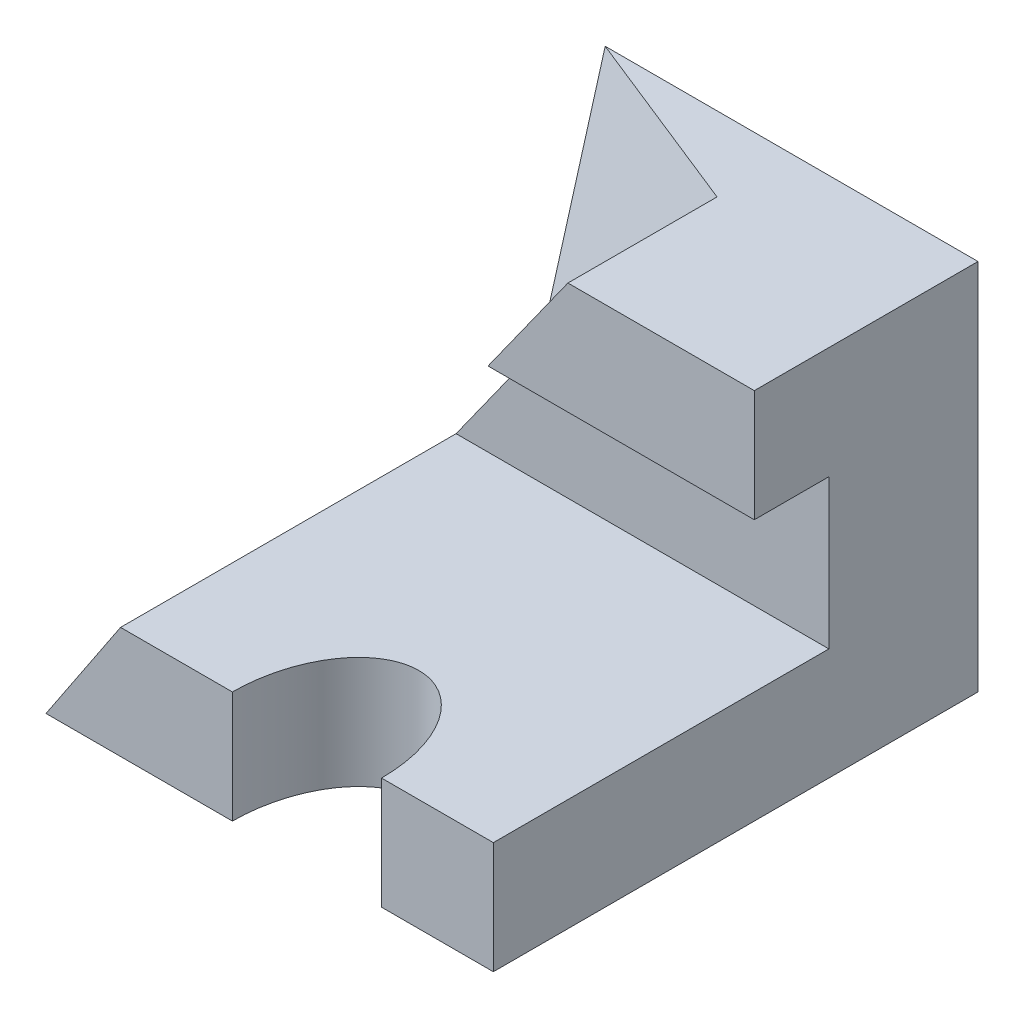
ISO-10303-21;
HEADER;
FILE_DESCRIPTION(('STEP AP214'),'2;1');
FILE_NAME('part.step','',(''),(''),'','','');
FILE_SCHEMA(('AUTOMOTIVE_DESIGN { 1 0 10303 214 1 1 1 1 }'));
ENDSEC;
DATA;
#1=APPLICATION_CONTEXT('core data for automotive mechanical design processes');
#2=APPLICATION_PROTOCOL_DEFINITION('international standard','automotive_design',2000,#1);
#3=PRODUCT_CONTEXT('',#1,'mechanical');
#4=PRODUCT('Part','Part','',(#3));
#5=PRODUCT_RELATED_PRODUCT_CATEGORY('part','',(#4));
#6=PRODUCT_DEFINITION_FORMATION('','',#4);
#7=PRODUCT_DEFINITION_CONTEXT('part definition',#1,'design');
#8=PRODUCT_DEFINITION('design','',#6,#7);
#9=PRODUCT_DEFINITION_SHAPE('','',#8);
#10=(LENGTH_UNIT() NAMED_UNIT(*) SI_UNIT(.MILLI.,.METRE.));
#11=(NAMED_UNIT(*) PLANE_ANGLE_UNIT() SI_UNIT($,.RADIAN.));
#12=(NAMED_UNIT(*) SI_UNIT($,.STERADIAN.) SOLID_ANGLE_UNIT());
#13=UNCERTAINTY_MEASURE_WITH_UNIT(LENGTH_MEASURE(1.E-05),#10,'distance_accuracy_value','');
#14=(GEOMETRIC_REPRESENTATION_CONTEXT(3) GLOBAL_UNCERTAINTY_ASSIGNED_CONTEXT((#13)) GLOBAL_UNIT_ASSIGNED_CONTEXT((#10,
#11,#12)) REPRESENTATION_CONTEXT('',''));
#15=CARTESIAN_POINT('',(0.,0.,0.));
#16=DIRECTION('',(0.,0.,1.));
#17=DIRECTION('',(1.,0.,0.));
#18=AXIS2_PLACEMENT_3D('',#15,#16,#17);
#19=CARTESIAN_POINT('',(0.,0.,65.));
#20=DIRECTION('',(0.,0.,1.));
#21=DIRECTION('',(1.,0.,0.));
#22=AXIS2_PLACEMENT_3D('',#19,#20,#21);
#23=PLANE('',#22);
#24=DIRECTION('',(0.,1.,0.));
#25=VECTOR('',#24,1.);
#26=CARTESIAN_POINT('',(35.,-15.,65.));
#27=LINE('',#26,#25);
#28=CARTESIAN_POINT('',(35.,-15.,65.));
#29=VERTEX_POINT('',#28);
#30=CARTESIAN_POINT('',(35.,0.,65.));
#31=VERTEX_POINT('',#30);
#32=EDGE_CURVE('E139',#29,#31,#27,.T.);
#33=ORIENTED_EDGE('',*,*,#32,.F.);
#34=DIRECTION('',(-1.,0.,0.));
#35=VECTOR('',#34,1.);
#36=CARTESIAN_POINT('',(0.,-15.,65.));
#37=LINE('',#36,#35);
#38=CARTESIAN_POINT('',(50.,-15.,65.));
#39=VERTEX_POINT('',#38);
#40=EDGE_CURVE('E147',#39,#29,#37,.T.);
#41=ORIENTED_EDGE('',*,*,#40,.F.);
#42=DIRECTION('',(0.,-1.,0.));
#43=VECTOR('',#42,1.);
#44=CARTESIAN_POINT('',(50.,0.,65.));
#45=LINE('',#44,#43);
#46=CARTESIAN_POINT('',(50.,0.,65.));
#47=VERTEX_POINT('',#46);
#48=EDGE_CURVE('E158',#47,#39,#45,.T.);
#49=ORIENTED_EDGE('',*,*,#48,.F.);
#50=DIRECTION('',(1.,0.,0.));
#51=VECTOR('',#50,1.);
#52=CARTESIAN_POINT('',(0.,0.,65.));
#53=LINE('',#52,#51);
#54=EDGE_CURVE('E166',#31,#47,#53,.T.);
#55=ORIENTED_EDGE('',*,*,#54,.F.);
#56=EDGE_LOOP('',(#33,#41,#49,#55));
#57=FACE_BOUND('',#56,.T.);
#58=ADVANCED_FACE('F45',(#57),#23,.T.);
#59=CARTESIAN_POINT('',(0.,35.,30.));
#60=DIRECTION('',(0.,-1.,0.));
#61=DIRECTION('',(0.,0.,-1.));
#62=AXIS2_PLACEMENT_3D('',#59,#60,#61);
#63=PLANE('',#62);
#64=DIRECTION('',(-0.928476690885259,0.,-0.371390676354104));
#65=VECTOR('',#64,1.);
#66=CARTESIAN_POINT('',(25.,35.,9.99999999999999));
#67=LINE('',#66,#65);
#68=CARTESIAN_POINT('',(25.,35.,9.99999999999999));
#69=VERTEX_POINT('',#68);
#70=CARTESIAN_POINT('',(0.,34.9999999999983,0.));
#71=VERTEX_POINT('',#70);
#72=EDGE_CURVE('E264',#69,#71,#67,.T.);
#73=ORIENTED_EDGE('',*,*,#72,.F.);
#74=DIRECTION('',(0.,0.,-1.));
#75=VECTOR('',#74,1.);
#76=CARTESIAN_POINT('',(25.,35.,30.));
#77=LINE('',#76,#75);
#78=CARTESIAN_POINT('',(25.,35.,30.));
#79=VERTEX_POINT('',#78);
#80=EDGE_CURVE('E225',#79,#69,#77,.T.);
#81=ORIENTED_EDGE('',*,*,#80,.F.);
#82=DIRECTION('',(-1.,0.,0.));
#83=VECTOR('',#82,1.);
#84=CARTESIAN_POINT('',(0.,35.,30.));
#85=LINE('',#84,#83);
#86=CARTESIAN_POINT('',(50.,35.,30.));
#87=VERTEX_POINT('',#86);
#88=EDGE_CURVE('E268',#87,#79,#85,.T.);
#89=ORIENTED_EDGE('',*,*,#88,.F.);
#90=DIRECTION('',(0.,0.,-1.));
#91=VECTOR('',#90,1.);
#92=CARTESIAN_POINT('',(50.,35.,30.));
#93=LINE('',#92,#91);
#94=CARTESIAN_POINT('',(50.,35.,0.));
#95=VERTEX_POINT('',#94);
#96=EDGE_CURVE('E228',#87,#95,#93,.T.);
#97=ORIENTED_EDGE('',*,*,#96,.T.);
#98=DIRECTION('',(-1.,0.,0.));
#99=VECTOR('',#98,1.);
#100=CARTESIAN_POINT('',(0.,35.,0.));
#101=LINE('',#100,#99);
#102=EDGE_CURVE('E202',#95,#71,#101,.T.);
#103=ORIENTED_EDGE('',*,*,#102,.T.);
#104=EDGE_LOOP('',(#73,#81,#89,#97,#103));
#105=FACE_BOUND('',#104,.T.);
#106=ADVANCED_FACE('F283',(#105),#63,.F.);
#107=CARTESIAN_POINT('',(0.,0.,10.));
#108=DIRECTION('',(-1.,0.,0.));
#109=DIRECTION('',(0.,0.,1.));
#110=AXIS2_PLACEMENT_3D('',#107,#108,#109);
#111=PLANE('',#110);
#112=DIRECTION('',(0.,0.,-1.));
#113=VECTOR('',#112,1.);
#114=CARTESIAN_POINT('',(0.,0.,10.));
#115=LINE('',#114,#113);
#116=CARTESIAN_POINT('',(0.,0.,10.));
#117=VERTEX_POINT('',#116);
#118=CARTESIAN_POINT('',(0.,0.,0.));
#119=VERTEX_POINT('',#118);
#120=EDGE_CURVE('E209',#117,#119,#115,.T.);
#121=ORIENTED_EDGE('',*,*,#120,.F.);
#122=DIRECTION('',(0.,-0.96152394764082,0.27472112789739));
#123=VECTOR('',#122,1.);
#124=CARTESIAN_POINT('',(0.,34.9999999999983,0.));
#125=LINE('',#124,#123);
#126=EDGE_CURVE('E69',#71,#117,#125,.T.);
#127=ORIENTED_EDGE('',*,*,#126,.F.);
#128=DIRECTION('',(0.,1.,0.));
#129=VECTOR('',#128,1.);
#130=CARTESIAN_POINT('',(0.,0.,0.));
#131=LINE('',#130,#129);
#132=EDGE_CURVE('E204',#119,#71,#131,.T.);
#133=ORIENTED_EDGE('',*,*,#132,.F.);
#134=EDGE_LOOP('',(#121,#127,#133));
#135=FACE_BOUND('',#134,.T.);
#136=ADVANCED_FACE('F258',(#135),#111,.T.);
#137=CARTESIAN_POINT('',(0.,0.,65.));
#138=DIRECTION('',(-0.832050294337844,0.554700196225229,0.));
#139=DIRECTION('',(-0.554700196225229,-0.832050294337844,0.));
#140=AXIS2_PLACEMENT_3D('',#137,#138,#139);
#141=PLANE('',#140);
#142=DIRECTION('',(0.554700196225229,0.832050294337844,0.));
#143=VECTOR('',#142,1.);
#144=CARTESIAN_POINT('',(0.,0.,0.));
#145=LINE('',#144,#143);
#146=CARTESIAN_POINT('',(-9.99999999999999,-15.,0.));
#147=VERTEX_POINT('',#146);
#148=EDGE_CURVE('E171',#147,#119,#145,.T.);
#149=ORIENTED_EDGE('',*,*,#148,.F.);
#150=DIRECTION('',(0.,0.,-1.));
#151=VECTOR('',#150,1.);
#152=CARTESIAN_POINT('',(-9.99999999999999,-15.,65.));
#153=LINE('',#152,#151);
#154=CARTESIAN_POINT('',(-9.99999999999999,-15.,65.));
#155=VERTEX_POINT('',#154);
#156=EDGE_CURVE('E11',#155,#147,#153,.T.);
#157=ORIENTED_EDGE('',*,*,#156,.F.);
#158=DIRECTION('',(0.554700196225229,0.832050294337844,0.));
#159=VECTOR('',#158,1.);
#160=CARTESIAN_POINT('',(0.,0.,65.));
#161=LINE('',#160,#159);
#162=CARTESIAN_POINT('',(0.,0.,65.));
#163=VERTEX_POINT('',#162);
#164=EDGE_CURVE('E153',#155,#163,#161,.T.);
#165=ORIENTED_EDGE('',*,*,#164,.T.);
#166=DIRECTION('',(0.,0.,-1.));
#167=VECTOR('',#166,1.);
#168=CARTESIAN_POINT('',(0.,0.,65.));
#169=LINE('',#168,#167);
#170=CARTESIAN_POINT('',(0.,0.,20.));
#171=VERTEX_POINT('',#170);
#172=EDGE_CURVE('E170',#163,#171,#169,.T.);
#173=ORIENTED_EDGE('',*,*,#172,.T.);
#174=DIRECTION('',(0.,0.,-1.));
#175=VECTOR('',#174,1.);
#176=CARTESIAN_POINT('',(0.,0.,20.));
#177=LINE('',#176,#175);
#178=EDGE_CURVE('E176',#171,#117,#177,.T.);
#179=ORIENTED_EDGE('',*,*,#178,.T.);
#180=ORIENTED_EDGE('',*,*,#120,.T.);
#181=EDGE_LOOP('',(#149,#157,#165,#173,#179,#180));
#182=FACE_BOUND('',#181,.T.);
#183=ADVANCED_FACE('F47',(#182),#141,.T.);
#184=CARTESIAN_POINT('',(0.,-15.,65.));
#185=DIRECTION('',(0.,-1.,0.));
#186=DIRECTION('',(1.,0.,0.));
#187=AXIS2_PLACEMENT_3D('',#184,#185,#186);
#188=PLANE('',#187);
#189=CARTESIAN_POINT('',(25.,-15.,65.));
#190=DIRECTION('',(0.,1.,0.));
#191=DIRECTION('',(0.,0.,1.));
#192=AXIS2_PLACEMENT_3D('',#189,#190,#191);
#193=ELLIPSE('',#192,15.,9.99999999999999);
#194=CARTESIAN_POINT('',(15.,-15.,65.));
#195=VERTEX_POINT('',#194);
#196=EDGE_CURVE('E132',#29,#195,#193,.T.);
#197=ORIENTED_EDGE('',*,*,#196,.T.);
#198=EDGE_CURVE('E144',#195,#155,#37,.T.);
#199=ORIENTED_EDGE('',*,*,#198,.T.);
#200=ORIENTED_EDGE('',*,*,#156,.T.);
#201=DIRECTION('',(-1.,0.,0.));
#202=VECTOR('',#201,1.);
#203=CARTESIAN_POINT('',(0.,-15.,0.));
#204=LINE('',#203,#202);
#205=CARTESIAN_POINT('',(50.,-15.,0.));
#206=VERTEX_POINT('',#205);
#207=EDGE_CURVE('E175',#206,#147,#204,.T.);
#208=ORIENTED_EDGE('',*,*,#207,.F.);
#209=DIRECTION('',(0.,0.,-1.));
#210=VECTOR('',#209,1.);
#211=CARTESIAN_POINT('',(50.,-15.,65.));
#212=LINE('',#211,#210);
#213=EDGE_CURVE('E54',#39,#206,#212,.T.);
#214=ORIENTED_EDGE('',*,*,#213,.F.);
#215=ORIENTED_EDGE('',*,*,#40,.T.);
#216=EDGE_LOOP('',(#197,#199,#200,#208,#214,#215));
#217=FACE_BOUND('',#216,.T.);
#218=ADVANCED_FACE('F143',(#217),#188,.T.);
#219=CARTESIAN_POINT('',(50.,0.,65.));
#220=DIRECTION('',(1.,0.,0.));
#221=DIRECTION('',(0.,0.,-1.));
#222=AXIS2_PLACEMENT_3D('',#219,#220,#221);
#223=PLANE('',#222);
#224=DIRECTION('',(0.,-1.,0.));
#225=VECTOR('',#224,1.);
#226=CARTESIAN_POINT('',(50.,0.,0.));
#227=LINE('',#226,#225);
#228=EDGE_CURVE('E159',#95,#206,#227,.T.);
#229=ORIENTED_EDGE('',*,*,#228,.F.);
#230=ORIENTED_EDGE('',*,*,#96,.F.);
#231=DIRECTION('',(0.,1.,0.));
#232=VECTOR('',#231,1.);
#233=CARTESIAN_POINT('',(50.,0.,30.));
#234=LINE('',#233,#232);
#235=CARTESIAN_POINT('',(50.,20.,30.));
#236=VERTEX_POINT('',#235);
#237=EDGE_CURVE('E214',#236,#87,#234,.T.);
#238=ORIENTED_EDGE('',*,*,#237,.F.);
#239=DIRECTION('',(0.,0.,-1.));
#240=VECTOR('',#239,1.);
#241=CARTESIAN_POINT('',(50.,20.,30.));
#242=LINE('',#241,#240);
#243=CARTESIAN_POINT('',(50.,20.,20.));
#244=VERTEX_POINT('',#243);
#245=EDGE_CURVE('E231',#236,#244,#242,.T.);
#246=ORIENTED_EDGE('',*,*,#245,.T.);
#247=DIRECTION('',(0.,1.,0.));
#248=VECTOR('',#247,1.);
#249=CARTESIAN_POINT('',(50.,0.,20.));
#250=LINE('',#249,#248);
#251=CARTESIAN_POINT('',(50.,0.,20.));
#252=VERTEX_POINT('',#251);
#253=EDGE_CURVE('E235',#252,#244,#250,.T.);
#254=ORIENTED_EDGE('',*,*,#253,.F.);
#255=DIRECTION('',(0.,0.,-1.));
#256=VECTOR('',#255,1.);
#257=CARTESIAN_POINT('',(50.,0.,65.));
#258=LINE('',#257,#256);
#259=EDGE_CURVE('E186',#47,#252,#258,.T.);
#260=ORIENTED_EDGE('',*,*,#259,.F.);
#261=ORIENTED_EDGE('',*,*,#48,.T.);
#262=ORIENTED_EDGE('',*,*,#213,.T.);
#263=EDGE_LOOP('',(#229,#230,#238,#246,#254,#260,#261,#262));
#264=FACE_BOUND('',#263,.T.);
#265=ADVANCED_FACE('F191',(#264),#223,.T.);
#266=CARTESIAN_POINT('',(0.,0.,65.));
#267=DIRECTION('',(0.,1.,0.));
#268=DIRECTION('',(0.,0.,1.));
#269=AXIS2_PLACEMENT_3D('',#266,#267,#268);
#270=PLANE('',#269);
#271=CARTESIAN_POINT('',(25.,0.,65.));
#272=DIRECTION('',(0.,1.,0.));
#273=DIRECTION('',(0.,0.,1.));
#274=AXIS2_PLACEMENT_3D('',#271,#272,#273);
#275=ELLIPSE('',#274,15.,9.99999999999999);
#276=CARTESIAN_POINT('',(15.,0.,65.));
#277=VERTEX_POINT('',#276);
#278=EDGE_CURVE('E61',#31,#277,#275,.T.);
#279=ORIENTED_EDGE('',*,*,#278,.F.);
#280=ORIENTED_EDGE('',*,*,#54,.T.);
#281=ORIENTED_EDGE('',*,*,#259,.T.);
#282=DIRECTION('',(1.,0.,0.));
#283=VECTOR('',#282,1.);
#284=CARTESIAN_POINT('',(0.,0.,20.));
#285=LINE('',#284,#283);
#286=EDGE_CURVE('E247',#171,#252,#285,.T.);
#287=ORIENTED_EDGE('',*,*,#286,.F.);
#288=ORIENTED_EDGE('',*,*,#172,.F.);
#289=EDGE_CURVE('E167',#163,#277,#53,.T.);
#290=ORIENTED_EDGE('',*,*,#289,.T.);
#291=EDGE_LOOP('',(#279,#280,#281,#287,#288,#290));
#292=FACE_BOUND('',#291,.T.);
#293=ADVANCED_FACE('F313',(#292),#270,.T.);
#294=DIRECTION('',(0.,1.,0.));
#295=VECTOR('',#294,1.);
#296=CARTESIAN_POINT('',(15.,-15.,65.));
#297=LINE('',#296,#295);
#298=EDGE_CURVE('E129',#195,#277,#297,.T.);
#299=ORIENTED_EDGE('',*,*,#298,.T.);
#300=ORIENTED_EDGE('',*,*,#289,.F.);
#301=ORIENTED_EDGE('',*,*,#164,.F.);
#302=ORIENTED_EDGE('',*,*,#198,.F.);
#303=EDGE_LOOP('',(#299,#300,#301,#302));
#304=FACE_BOUND('',#303,.T.);
#305=ADVANCED_FACE('F151',(#304),#23,.T.);
#306=CARTESIAN_POINT('',(0.,0.,0.));
#307=DIRECTION('',(0.,0.,1.));
#308=DIRECTION('',(1.,0.,0.));
#309=AXIS2_PLACEMENT_3D('',#306,#307,#308);
#310=PLANE('',#309);
#311=ORIENTED_EDGE('',*,*,#148,.T.);
#312=ORIENTED_EDGE('',*,*,#132,.T.);
#313=ORIENTED_EDGE('',*,*,#102,.F.);
#314=ORIENTED_EDGE('',*,*,#228,.T.);
#315=ORIENTED_EDGE('',*,*,#207,.T.);
#316=EDGE_LOOP('',(#311,#312,#313,#314,#315));
#317=FACE_BOUND('',#316,.T.);
#318=ADVANCED_FACE('F199',(#317),#310,.F.);
#319=CARTESIAN_POINT('',(0.,0.,20.));
#320=DIRECTION('',(0.813733471206735,-0.581238193719096,0.));
#321=DIRECTION('',(0.581238193719096,0.813733471206735,0.));
#322=AXIS2_PLACEMENT_3D('',#319,#320,#321);
#323=PLANE('',#322);
#324=ORIENTED_EDGE('',*,*,#80,.T.);
#325=DIRECTION('',(-0.581238193719096,-0.813733471206735,0.));
#326=VECTOR('',#325,1.);
#327=CARTESIAN_POINT('',(0.,0.,10.));
#328=LINE('',#327,#326);
#329=EDGE_CURVE('E216',#69,#117,#328,.T.);
#330=ORIENTED_EDGE('',*,*,#329,.T.);
#331=ORIENTED_EDGE('',*,*,#178,.F.);
#332=DIRECTION('',(-0.581238193719096,-0.813733471206735,0.));
#333=VECTOR('',#332,1.);
#334=CARTESIAN_POINT('',(0.,0.,20.));
#335=LINE('',#334,#333);
#336=CARTESIAN_POINT('',(14.2857142857143,20.,20.));
#337=VERTEX_POINT('',#336);
#338=EDGE_CURVE('E243',#337,#171,#335,.T.);
#339=ORIENTED_EDGE('',*,*,#338,.F.);
#340=DIRECTION('',(0.,0.,-1.));
#341=VECTOR('',#340,1.);
#342=CARTESIAN_POINT('',(14.2857142857143,20.,30.));
#343=LINE('',#342,#341);
#344=CARTESIAN_POINT('',(14.2857142857143,20.,30.));
#345=VERTEX_POINT('',#344);
#346=EDGE_CURVE('E222',#345,#337,#343,.T.);
#347=ORIENTED_EDGE('',*,*,#346,.F.);
#348=DIRECTION('',(-0.581238193719096,-0.813733471206735,0.));
#349=VECTOR('',#348,1.);
#350=CARTESIAN_POINT('',(0.,0.,30.));
#351=LINE('',#350,#349);
#352=EDGE_CURVE('E220',#79,#345,#351,.T.);
#353=ORIENTED_EDGE('',*,*,#352,.F.);
#354=EDGE_LOOP('',(#324,#330,#331,#339,#347,#353));
#355=FACE_BOUND('',#354,.T.);
#356=ADVANCED_FACE('F278',(#355),#323,.F.);
#357=CARTESIAN_POINT('',(0.,0.,20.));
#358=DIRECTION('',(0.,0.,1.));
#359=DIRECTION('',(1.,0.,0.));
#360=AXIS2_PLACEMENT_3D('',#357,#358,#359);
#361=PLANE('',#360);
#362=ORIENTED_EDGE('',*,*,#253,.T.);
#363=DIRECTION('',(-1.,0.,0.));
#364=VECTOR('',#363,1.);
#365=CARTESIAN_POINT('',(0.,20.,20.));
#366=LINE('',#365,#364);
#367=EDGE_CURVE('E239',#244,#337,#366,.T.);
#368=ORIENTED_EDGE('',*,*,#367,.T.);
#369=ORIENTED_EDGE('',*,*,#338,.T.);
#370=ORIENTED_EDGE('',*,*,#286,.T.);
#371=EDGE_LOOP('',(#362,#368,#369,#370));
#372=FACE_BOUND('',#371,.T.);
#373=ADVANCED_FACE('F305',(#372),#361,.T.);
#374=CARTESIAN_POINT('',(0.,20.,30.));
#375=DIRECTION('',(0.,-1.,0.));
#376=DIRECTION('',(1.,0.,0.));
#377=AXIS2_PLACEMENT_3D('',#374,#375,#376);
#378=PLANE('',#377);
#379=ORIENTED_EDGE('',*,*,#367,.F.);
#380=ORIENTED_EDGE('',*,*,#245,.F.);
#381=DIRECTION('',(-1.,0.,0.));
#382=VECTOR('',#381,1.);
#383=CARTESIAN_POINT('',(0.,20.,30.));
#384=LINE('',#383,#382);
#385=EDGE_CURVE('E208',#236,#345,#384,.T.);
#386=ORIENTED_EDGE('',*,*,#385,.T.);
#387=ORIENTED_EDGE('',*,*,#346,.T.);
#388=EDGE_LOOP('',(#379,#380,#386,#387));
#389=FACE_BOUND('',#388,.T.);
#390=ADVANCED_FACE('F280',(#389),#378,.T.);
#391=CARTESIAN_POINT('',(0.,0.,30.));
#392=DIRECTION('',(0.,0.,1.));
#393=DIRECTION('',(1.,0.,0.));
#394=AXIS2_PLACEMENT_3D('',#391,#392,#393);
#395=PLANE('',#394);
#396=ORIENTED_EDGE('',*,*,#385,.F.);
#397=ORIENTED_EDGE('',*,*,#237,.T.);
#398=ORIENTED_EDGE('',*,*,#88,.T.);
#399=ORIENTED_EDGE('',*,*,#352,.T.);
#400=EDGE_LOOP('',(#396,#397,#398,#399));
#401=FACE_BOUND('',#400,.T.);
#402=ADVANCED_FACE('F277',(#401),#395,.T.);
#403=CARTESIAN_POINT('',(-3.22156476002639,2.30111768573314,8.05391190006559));
#404=DIRECTION('',(-0.358974358974373,0.256410256410266,0.897435897435889));
#405=DIRECTION('',(0.928476690885253,0.,0.371390676354119));
#406=AXIS2_PLACEMENT_3D('',#403,#404,#405);
#407=PLANE('',#406);
#408=ORIENTED_EDGE('',*,*,#329,.F.);
#409=ORIENTED_EDGE('',*,*,#72,.T.);
#410=ORIENTED_EDGE('',*,*,#126,.T.);
#411=EDGE_LOOP('',(#408,#409,#410));
#412=FACE_BOUND('',#411,.T.);
#413=ADVANCED_FACE('F284',(#412),#407,.T.);
#414=DIRECTION('',(0.,1.,0.));
#415=VECTOR('',#414,1.);
#416=SURFACE_OF_LINEAR_EXTRUSION('',#193,#415);
#417=ORIENTED_EDGE('',*,*,#278,.T.);
#418=ORIENTED_EDGE('',*,*,#298,.F.);
#419=ORIENTED_EDGE('',*,*,#196,.F.);
#420=ORIENTED_EDGE('',*,*,#32,.T.);
#421=EDGE_LOOP('',(#417,#418,#419,#420));
#422=FACE_BOUND('',#421,.T.);
#423=ADVANCED_FACE('F131',(#422),#416,.F.);
#424=CLOSED_SHELL('',(#58,#106,#136,#183,#218,#265,#293,#305,#318,#356,#373,#390,#402,#413,#423));
#425=MANIFOLD_SOLID_BREP('B2',#424);
#426=ADVANCED_BREP_SHAPE_REPRESENTATION('',(#18,#425),#14);
#427=SHAPE_DEFINITION_REPRESENTATION(#9,#426);
ENDSEC;
END-ISO-10303-21;
